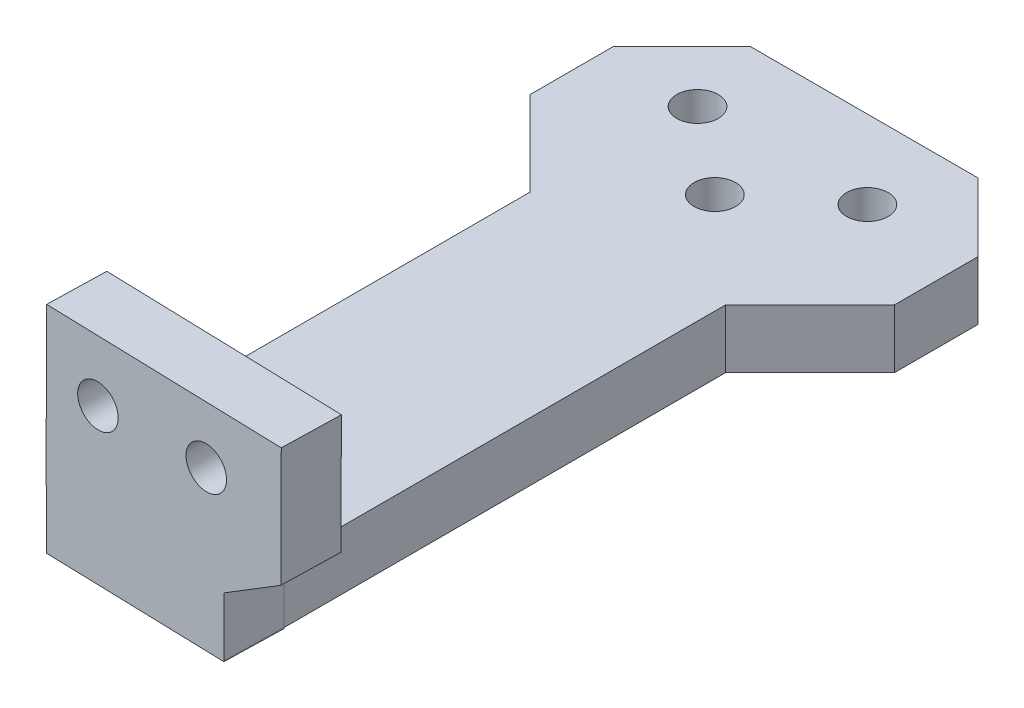
ISO-10303-21;
HEADER;
FILE_DESCRIPTION(('STEP AP214'),'2;1');
FILE_NAME('part.step','',(''),(''),'','','');
FILE_SCHEMA(('AUTOMOTIVE_DESIGN { 1 0 10303 214 1 1 1 1 }'));
ENDSEC;
DATA;
#1=APPLICATION_CONTEXT('core data for automotive mechanical design processes');
#2=APPLICATION_PROTOCOL_DEFINITION('international standard','automotive_design',2000,#1);
#3=PRODUCT_CONTEXT('',#1,'mechanical');
#4=PRODUCT('Part','Part','',(#3));
#5=PRODUCT_RELATED_PRODUCT_CATEGORY('part','',(#4));
#6=PRODUCT_DEFINITION_FORMATION('','',#4);
#7=PRODUCT_DEFINITION_CONTEXT('part definition',#1,'design');
#8=PRODUCT_DEFINITION('design','',#6,#7);
#9=PRODUCT_DEFINITION_SHAPE('','',#8);
#10=(LENGTH_UNIT() NAMED_UNIT(*) SI_UNIT(.MILLI.,.METRE.));
#11=(NAMED_UNIT(*) PLANE_ANGLE_UNIT() SI_UNIT($,.RADIAN.));
#12=(NAMED_UNIT(*) SI_UNIT($,.STERADIAN.) SOLID_ANGLE_UNIT());
#13=UNCERTAINTY_MEASURE_WITH_UNIT(LENGTH_MEASURE(1.E-05),#10,'distance_accuracy_value','');
#14=(GEOMETRIC_REPRESENTATION_CONTEXT(3) GLOBAL_UNCERTAINTY_ASSIGNED_CONTEXT((#13)) GLOBAL_UNIT_ASSIGNED_CONTEXT((#10,
#11,#12)) REPRESENTATION_CONTEXT('',''));
#15=CARTESIAN_POINT('',(0.,0.,0.));
#16=DIRECTION('',(0.,0.,1.));
#17=DIRECTION('',(1.,0.,0.));
#18=AXIS2_PLACEMENT_3D('',#15,#16,#17);
#19=CARTESIAN_POINT('',(0.5975916541765,0.,-24.3393126845238));
#20=DIRECTION('',(-0.0245451308027947,0.,0.999698722892989));
#21=DIRECTION('',(-0.999698722892989,0.,-0.0245451308027947));
#22=AXIS2_PLACEMENT_3D('',#19,#20,#21);
#23=PLANE('',#22);
#24=CARTESIAN_POINT('',(-3.38225333063673,16.7282372679157,-24.4370279396203));
#25=DIRECTION('',(-0.0245451308027946,0.,0.999698722892989));
#26=DIRECTION('',(0.999698722892989,0.,0.0245451308027946));
#27=AXIS2_PLACEMENT_3D('',#24,#25,#26);
#28=CIRCLE('',#27,2.24790000000673);
#29=CARTESIAN_POINT('',(-1.13503057143885,16.7282372679157,-24.3818529400885));
#30=VERTEX_POINT('',#29);
#31=EDGE_CURVE('E357',#30,#30,#28,.T.);
#32=ORIENTED_EDGE('',*,*,#31,.T.);
#33=EDGE_LOOP('',(#32));
#34=FACE_BOUND('',#33,.T.);
#35=CARTESIAN_POINT('',(8.62803223379969,17.0846353252613,-24.1421450680038));
#36=DIRECTION('',(-0.0245451308027946,0.,0.999698722892989));
#37=DIRECTION('',(0.999698722892989,0.,0.0245451308027946));
#38=AXIS2_PLACEMENT_3D('',#35,#36,#37);
#39=CIRCLE('',#38,2.24790000000672);
#40=CARTESIAN_POINT('',(10.8752549929976,17.0846353252613,-24.086970068472));
#41=VERTEX_POINT('',#40);
#42=EDGE_CURVE('E358',#41,#41,#39,.T.);
#43=ORIENTED_EDGE('',*,*,#42,.T.);
#44=EDGE_LOOP('',(#43));
#45=FACE_BOUND('',#44,.T.);
#46=DIRECTION('',(-0.999698722892989,0.,-0.0245451308027947));
#47=VECTOR('',#46,1.);
#48=CARTESIAN_POINT('',(0.597591654176501,6.35,-24.3393126845238));
#49=LINE('',#48,#47);
#50=CARTESIAN_POINT('',(10.5664845459525,6.35,-24.0945511634932));
#51=VERTEX_POINT('',#50);
#52=CARTESIAN_POINT('',(-9.14070594421671,6.35,-24.578412508176));
#53=VERTEX_POINT('',#52);
#54=EDGE_CURVE('E200',#51,#53,#49,.T.);
#55=ORIENTED_EDGE('',*,*,#54,.T.);
#56=DIRECTION('',(-0.00439645934331877,-0.99999032969989,-0.000107944190764562));
#57=VECTOR('',#56,1.);
#58=CARTESIAN_POINT('',(-9.06610570774999,23.3180893725102,-24.5765808837876));
#59=LINE('',#58,#57);
#60=CARTESIAN_POINT('',(-9.06610570774999,23.3180893725102,-24.5765808837876));
#61=VERTEX_POINT('',#60);
#62=EDGE_CURVE('E286',#61,#53,#59,.T.);
#63=ORIENTED_EDGE('',*,*,#62,.F.);
#64=DIRECTION('',(-0.999689055506319,0.00439778429504862,-0.0245448934440134));
#65=VECTOR('',#64,1.);
#66=CARTESIAN_POINT('',(16.9407170912385,23.203681401112,-23.9380476409732));
#67=LINE('',#66,#65);
#68=CARTESIAN_POINT('',(16.9407170912385,23.203681401112,-23.9380476409732));
#69=VERTEX_POINT('',#68);
#70=EDGE_CURVE('E383',#69,#61,#67,.T.);
#71=ORIENTED_EDGE('',*,*,#70,.F.);
#72=DIRECTION('',(0.00439645934331877,0.99999032969989,0.000107944190764413));
#73=VECTOR('',#72,1.);
#74=CARTESIAN_POINT('',(16.9407170912385,23.203681401112,-23.9380476409732));
#75=LINE('',#74,#73);
#76=CARTESIAN_POINT('',(16.8839683571341,10.2959797949635,-23.9394409658515));
#77=VERTEX_POINT('',#76);
#78=EDGE_CURVE('E305',#77,#69,#75,.T.);
#79=ORIENTED_EDGE('',*,*,#78,.F.);
#80=DIRECTION('',(-0.847962118438704,-0.529647797487237,-0.0208196135858428));
#81=VECTOR('',#80,1.);
#82=CARTESIAN_POINT('',(10.5664845459525,6.35,-24.0945511634932));
#83=LINE('',#82,#81);
#84=EDGE_CURVE('E172',#77,#51,#83,.T.);
#85=ORIENTED_EDGE('',*,*,#84,.T.);
#86=EDGE_LOOP('',(#55,#63,#71,#79,#85));
#87=FACE_BOUND('',#86,.T.);
#88=ADVANCED_FACE('F41',(#34,#45,#87),#23,.F.);
#89=CARTESIAN_POINT('',(0.,6.35,0.));
#90=DIRECTION('',(0.,1.,0.));
#91=DIRECTION('',(0.,0.,-1.));
#92=AXIS2_PLACEMENT_3D('',#89,#90,#91);
#93=PLANE('',#92);
#94=DIRECTION('',(0.179140165281254,0.,0.98382356201862));
#95=VECTOR('',#94,1.);
#96=CARTESIAN_POINT('',(-9.14070594421671,6.35,-24.578412508176));
#97=LINE('',#96,#95);
#98=CARTESIAN_POINT('',(-10.5664845459524,6.35,-32.4086753663532));
#99=VERTEX_POINT('',#98);
#100=EDGE_CURVE('E341',#99,#53,#97,.T.);
#101=ORIENTED_EDGE('',*,*,#100,.T.);
#102=ORIENTED_EDGE('',*,*,#54,.F.);
#103=DIRECTION('',(0.,0.,1.));
#104=VECTOR('',#103,1.);
#105=CARTESIAN_POINT('',(10.5664845459524,6.35,-71.843509550559));
#106=LINE('',#105,#104);
#107=CARTESIAN_POINT('',(10.5664845459524,6.35,-71.843509550559));
#108=VERTEX_POINT('',#107);
#109=EDGE_CURVE('E189',#108,#51,#106,.T.);
#110=ORIENTED_EDGE('',*,*,#109,.F.);
#111=DIRECTION('',(-0.707106781186547,0.,0.707106781186548));
#112=VECTOR('',#111,1.);
#113=CARTESIAN_POINT('',(19.6998793715268,6.35,-80.9769043761334));
#114=LINE('',#113,#112);
#115=CARTESIAN_POINT('',(19.6998793715268,6.35,-80.9769043761334));
#116=VERTEX_POINT('',#115);
#117=EDGE_CURVE('E229',#116,#108,#114,.T.);
#118=ORIENTED_EDGE('',*,*,#117,.F.);
#119=DIRECTION('',(0.,0.,1.));
#120=VECTOR('',#119,1.);
#121=CARTESIAN_POINT('',(19.6998793715268,6.35,14.5616917387912));
#122=LINE('',#121,#120);
#123=CARTESIAN_POINT('',(19.6998793715268,6.35,-90.0191075086382));
#124=VERTEX_POINT('',#123);
#125=EDGE_CURVE('E191',#124,#116,#122,.T.);
#126=ORIENTED_EDGE('',*,*,#125,.F.);
#127=DIRECTION('',(0.707106781186547,0.,0.707106781186548));
#128=VECTOR('',#127,1.);
#129=CARTESIAN_POINT('',(12.3270420752059,6.35,-97.3919448049591));
#130=LINE('',#129,#128);
#131=CARTESIAN_POINT('',(12.3270420752059,6.35,-97.3919448049591));
#132=VERTEX_POINT('',#131);
#133=EDGE_CURVE('E226',#132,#124,#130,.T.);
#134=ORIENTED_EDGE('',*,*,#133,.F.);
#135=DIRECTION('',(1.,0.,0.));
#136=VECTOR('',#135,1.);
#137=CARTESIAN_POINT('',(-19.6998793715268,6.35,-97.3919448049591));
#138=LINE('',#137,#136);
#139=CARTESIAN_POINT('',(-12.3270420752059,6.35,-97.3919448049591));
#140=VERTEX_POINT('',#139);
#141=EDGE_CURVE('E269',#140,#132,#138,.T.);
#142=ORIENTED_EDGE('',*,*,#141,.F.);
#143=DIRECTION('',(0.707106781186548,0.,-0.707106781186548));
#144=VECTOR('',#143,1.);
#145=CARTESIAN_POINT('',(-12.3270420752059,6.35,-97.3919448049591));
#146=LINE('',#145,#144);
#147=CARTESIAN_POINT('',(-19.6998793715268,6.35,-90.0191075086382));
#148=VERTEX_POINT('',#147);
#149=EDGE_CURVE('E223',#148,#140,#146,.T.);
#150=ORIENTED_EDGE('',*,*,#149,.F.);
#151=DIRECTION('',(0.,0.,-1.));
#152=VECTOR('',#151,1.);
#153=CARTESIAN_POINT('',(-19.6998793715268,6.35,14.5616917387912));
#154=LINE('',#153,#152);
#155=CARTESIAN_POINT('',(-19.6998793715268,6.35,-80.9769043761334));
#156=VERTEX_POINT('',#155);
#157=EDGE_CURVE('E266',#156,#148,#154,.T.);
#158=ORIENTED_EDGE('',*,*,#157,.F.);
#159=DIRECTION('',(-0.707106781186548,0.,-0.707106781186547));
#160=VECTOR('',#159,1.);
#161=CARTESIAN_POINT('',(-10.5664845459524,6.35,-71.843509550559));
#162=LINE('',#161,#160);
#163=CARTESIAN_POINT('',(-10.5664845459524,6.35,-71.843509550559));
#164=VERTEX_POINT('',#163);
#165=EDGE_CURVE('E219',#164,#156,#162,.T.);
#166=ORIENTED_EDGE('',*,*,#165,.F.);
#167=DIRECTION('',(0.,0.,-1.));
#168=VECTOR('',#167,1.);
#169=CARTESIAN_POINT('',(-10.5664845459524,6.35,-21.8784368138053));
#170=LINE('',#169,#168);
#171=EDGE_CURVE('E216',#99,#164,#170,.T.);
#172=ORIENTED_EDGE('',*,*,#171,.F.);
#173=EDGE_LOOP('',(#101,#102,#110,#118,#126,#134,#142,#150,#158,#166,#172));
#174=FACE_BOUND('',#173,.T.);
#175=CARTESIAN_POINT('',(8.83739968952087,6.35,-88.9179733151553));
#176=DIRECTION('',(0.,1.,0.));
#177=DIRECTION('',(0.,0.,1.));
#178=AXIS2_PLACEMENT_3D('',#175,#176,#177);
#179=CIRCLE('',#178,2.2479);
#180=CARTESIAN_POINT('',(8.83739968952087,6.35,-86.6700733151553));
#181=VERTEX_POINT('',#180);
#182=EDGE_CURVE('E255',#181,#181,#179,.T.);
#183=ORIENTED_EDGE('',*,*,#182,.F.);
#184=EDGE_LOOP('',(#183));
#185=FACE_BOUND('',#184,.T.);
#186=CARTESIAN_POINT('',(-0.345903119202115,6.35,-81.6070978447811));
#187=DIRECTION('',(0.,1.,0.));
#188=DIRECTION('',(0.,0.,1.));
#189=AXIS2_PLACEMENT_3D('',#186,#187,#188);
#190=CIRCLE('',#189,2.2479);
#191=CARTESIAN_POINT('',(-0.345903119202115,6.35,-79.3591978447811));
#192=VERTEX_POINT('',#191);
#193=EDGE_CURVE('E248',#192,#192,#190,.T.);
#194=ORIENTED_EDGE('',*,*,#193,.F.);
#195=EDGE_LOOP('',(#194));
#196=FACE_BOUND('',#195,.T.);
#197=CARTESIAN_POINT('',(-9.52920592792509,6.35,-88.9179733151553));
#198=DIRECTION('',(0.,1.,0.));
#199=DIRECTION('',(0.,0.,1.));
#200=AXIS2_PLACEMENT_3D('',#197,#198,#199);
#201=CIRCLE('',#200,2.2479);
#202=CARTESIAN_POINT('',(-9.52920592792509,6.35,-86.6700733151553));
#203=VERTEX_POINT('',#202);
#204=EDGE_CURVE('E260',#203,#203,#201,.T.);
#205=ORIENTED_EDGE('',*,*,#204,.F.);
#206=EDGE_LOOP('',(#205));
#207=FACE_BOUND('',#206,.T.);
#208=ADVANCED_FACE('F337',(#174,#185,#196,#207),#93,.T.);
#209=CARTESIAN_POINT('',(0.,0.,0.));
#210=DIRECTION('',(0.,1.,0.));
#211=DIRECTION('',(0.,0.,-1.));
#212=AXIS2_PLACEMENT_3D('',#209,#210,#211);
#213=PLANE('',#212);
#214=CARTESIAN_POINT('',(-9.52920592792509,0.,-88.9179733151553));
#215=DIRECTION('',(0.,1.,0.));
#216=DIRECTION('',(0.,0.,1.));
#217=AXIS2_PLACEMENT_3D('',#214,#215,#216);
#218=CIRCLE('',#217,2.2479);
#219=CARTESIAN_POINT('',(-9.52920592792509,0.,-86.6700733151553));
#220=VERTEX_POINT('',#219);
#221=EDGE_CURVE('E251',#220,#220,#218,.T.);
#222=ORIENTED_EDGE('',*,*,#221,.T.);
#223=EDGE_LOOP('',(#222));
#224=FACE_BOUND('',#223,.T.);
#225=CARTESIAN_POINT('',(-0.345903119202115,0.,-81.6070978447811));
#226=DIRECTION('',(0.,1.,0.));
#227=DIRECTION('',(0.,0.,1.));
#228=AXIS2_PLACEMENT_3D('',#225,#226,#227);
#229=CIRCLE('',#228,2.2479);
#230=CARTESIAN_POINT('',(-0.345903119202115,0.,-79.3591978447811));
#231=VERTEX_POINT('',#230);
#232=EDGE_CURVE('E252',#231,#231,#229,.T.);
#233=ORIENTED_EDGE('',*,*,#232,.T.);
#234=EDGE_LOOP('',(#233));
#235=FACE_BOUND('',#234,.T.);
#236=CARTESIAN_POINT('',(8.83739968952087,0.,-88.9179733151553));
#237=DIRECTION('',(0.,1.,0.));
#238=DIRECTION('',(0.,0.,1.));
#239=AXIS2_PLACEMENT_3D('',#236,#237,#238);
#240=CIRCLE('',#239,2.2479);
#241=CARTESIAN_POINT('',(8.83739968952087,0.,-86.6700733151553));
#242=VERTEX_POINT('',#241);
#243=EDGE_CURVE('E236',#242,#242,#240,.T.);
#244=ORIENTED_EDGE('',*,*,#243,.T.);
#245=EDGE_LOOP('',(#244));
#246=FACE_BOUND('',#245,.T.);
#247=DIRECTION('',(0.,0.,-1.));
#248=VECTOR('',#247,1.);
#249=CARTESIAN_POINT('',(-10.5664845459524,0.,-21.8784368138053));
#250=LINE('',#249,#248);
#251=CARTESIAN_POINT('',(-10.5664845459524,0.,-32.4086753663532));
#252=VERTEX_POINT('',#251);
#253=CARTESIAN_POINT('',(-10.5664845459524,0.,-71.843509550559));
#254=VERTEX_POINT('',#253);
#255=EDGE_CURVE('E233',#252,#254,#250,.T.);
#256=ORIENTED_EDGE('',*,*,#255,.T.);
#257=DIRECTION('',(-0.707106781186548,0.,-0.707106781186547));
#258=VECTOR('',#257,1.);
#259=CARTESIAN_POINT('',(-10.5664845459524,0.,-71.843509550559));
#260=LINE('',#259,#258);
#261=CARTESIAN_POINT('',(-19.6998793715268,0.,-80.9769043761334));
#262=VERTEX_POINT('',#261);
#263=EDGE_CURVE('E316',#254,#262,#260,.T.);
#264=ORIENTED_EDGE('',*,*,#263,.T.);
#265=DIRECTION('',(0.,0.,-1.));
#266=VECTOR('',#265,1.);
#267=CARTESIAN_POINT('',(-19.6998793715268,0.,14.5616917387912));
#268=LINE('',#267,#266);
#269=CARTESIAN_POINT('',(-19.6998793715268,0.,-90.0191075086382));
#270=VERTEX_POINT('',#269);
#271=EDGE_CURVE('E263',#262,#270,#268,.T.);
#272=ORIENTED_EDGE('',*,*,#271,.T.);
#273=DIRECTION('',(0.707106781186548,0.,-0.707106781186548));
#274=VECTOR('',#273,1.);
#275=CARTESIAN_POINT('',(-12.3270420752059,0.,-97.3919448049591));
#276=LINE('',#275,#274);
#277=CARTESIAN_POINT('',(-12.3270420752059,0.,-97.3919448049591));
#278=VERTEX_POINT('',#277);
#279=EDGE_CURVE('E319',#270,#278,#276,.T.);
#280=ORIENTED_EDGE('',*,*,#279,.T.);
#281=DIRECTION('',(1.,0.,0.));
#282=VECTOR('',#281,1.);
#283=CARTESIAN_POINT('',(-19.6998793715268,0.,-97.3919448049591));
#284=LINE('',#283,#282);
#285=CARTESIAN_POINT('',(12.3270420752059,0.,-97.3919448049591));
#286=VERTEX_POINT('',#285);
#287=EDGE_CURVE('E277',#278,#286,#284,.T.);
#288=ORIENTED_EDGE('',*,*,#287,.T.);
#289=DIRECTION('',(0.707106781186547,0.,0.707106781186548));
#290=VECTOR('',#289,1.);
#291=CARTESIAN_POINT('',(12.3270420752059,0.,-97.3919448049591));
#292=LINE('',#291,#290);
#293=CARTESIAN_POINT('',(19.6998793715268,0.,-90.0191075086382));
#294=VERTEX_POINT('',#293);
#295=EDGE_CURVE('E212',#286,#294,#292,.T.);
#296=ORIENTED_EDGE('',*,*,#295,.T.);
#297=DIRECTION('',(0.,0.,1.));
#298=VECTOR('',#297,1.);
#299=CARTESIAN_POINT('',(19.6998793715268,0.,14.5616917387912));
#300=LINE('',#299,#298);
#301=CARTESIAN_POINT('',(19.6998793715268,0.,-80.9769043761334));
#302=VERTEX_POINT('',#301);
#303=EDGE_CURVE('E270',#294,#302,#300,.T.);
#304=ORIENTED_EDGE('',*,*,#303,.T.);
#305=DIRECTION('',(-0.707106781186547,0.,0.707106781186548));
#306=VECTOR('',#305,1.);
#307=CARTESIAN_POINT('',(19.6998793715268,0.,-80.9769043761334));
#308=LINE('',#307,#306);
#309=CARTESIAN_POINT('',(10.5664845459524,0.,-71.843509550559));
#310=VERTEX_POINT('',#309);
#311=EDGE_CURVE('E207',#302,#310,#308,.T.);
#312=ORIENTED_EDGE('',*,*,#311,.T.);
#313=DIRECTION('',(0.,0.,1.));
#314=VECTOR('',#313,1.);
#315=CARTESIAN_POINT('',(10.5664845459524,0.,-71.843509550559));
#316=LINE('',#315,#314);
#317=CARTESIAN_POINT('',(10.5664845459525,0.,-24.0945511634932));
#318=VERTEX_POINT('',#317);
#319=EDGE_CURVE('E186',#310,#318,#316,.T.);
#320=ORIENTED_EDGE('',*,*,#319,.T.);
#321=DIRECTION('',(-0.999698722892989,0.,-0.0245451308027947));
#322=VECTOR('',#321,1.);
#323=CARTESIAN_POINT('',(0.597591654176501,0.,-24.3393126845238));
#324=LINE('',#323,#322);
#325=CARTESIAN_POINT('',(-9.14070594421671,-6.14072964439521E-05,-24.578412508176));
#326=VERTEX_POINT('',#325);
#327=EDGE_CURVE('E194',#318,#326,#324,.T.);
#328=ORIENTED_EDGE('',*,*,#327,.T.);
#329=DIRECTION('',(0.179140165281254,0.,0.98382356201862));
#330=VECTOR('',#329,1.);
#331=CARTESIAN_POINT('',(-4.51561340049107,0.,0.822228458576912));
#332=LINE('',#331,#330);
#333=EDGE_CURVE('E297',#252,#326,#332,.T.);
#334=ORIENTED_EDGE('',*,*,#333,.F.);
#335=EDGE_LOOP('',(#256,#264,#272,#280,#288,#296,#304,#312,#320,#328,#334));
#336=FACE_BOUND('',#335,.T.);
#337=ADVANCED_FACE('F204',(#224,#235,#246,#336),#213,.F.);
#338=CARTESIAN_POINT('',(10.5664845459524,0.,-71.843509550559));
#339=DIRECTION('',(1.,0.,0.));
#340=DIRECTION('',(0.,0.,1.));
#341=AXIS2_PLACEMENT_3D('',#338,#339,#340);
#342=PLANE('',#341);
#343=ORIENTED_EDGE('',*,*,#319,.F.);
#344=DIRECTION('',(0.,1.,0.));
#345=VECTOR('',#344,1.);
#346=CARTESIAN_POINT('',(10.5664845459524,0.,-71.843509550559));
#347=LINE('',#346,#345);
#348=EDGE_CURVE('E234',#310,#108,#347,.T.);
#349=ORIENTED_EDGE('',*,*,#348,.T.);
#350=ORIENTED_EDGE('',*,*,#109,.T.);
#351=DIRECTION('',(0.,1.,0.));
#352=VECTOR('',#351,1.);
#353=CARTESIAN_POINT('',(10.5664845459524,0.,-24.0945511634931));
#354=LINE('',#353,#352);
#355=EDGE_CURVE('E168',#318,#51,#354,.T.);
#356=ORIENTED_EDGE('',*,*,#355,.F.);
#357=EDGE_LOOP('',(#343,#349,#350,#356));
#358=FACE_BOUND('',#357,.T.);
#359=ADVANCED_FACE('F184',(#358),#342,.T.);
#360=CARTESIAN_POINT('',(-19.6998793715268,6.35,14.5616917387912));
#361=DIRECTION('',(1.,0.,0.));
#362=DIRECTION('',(0.,0.,1.));
#363=AXIS2_PLACEMENT_3D('',#360,#361,#362);
#364=PLANE('',#363);
#365=DIRECTION('',(0.,1.,0.));
#366=VECTOR('',#365,1.);
#367=CARTESIAN_POINT('',(-19.6998793715268,0.,-90.0191075086382));
#368=LINE('',#367,#366);
#369=EDGE_CURVE('E245',#270,#148,#368,.T.);
#370=ORIENTED_EDGE('',*,*,#369,.F.);
#371=ORIENTED_EDGE('',*,*,#271,.F.);
#372=DIRECTION('',(0.,1.,0.));
#373=VECTOR('',#372,1.);
#374=CARTESIAN_POINT('',(-19.6998793715268,0.,-80.9769043761334));
#375=LINE('',#374,#373);
#376=EDGE_CURVE('E210',#262,#156,#375,.T.);
#377=ORIENTED_EDGE('',*,*,#376,.T.);
#378=ORIENTED_EDGE('',*,*,#157,.T.);
#379=EDGE_LOOP('',(#370,#371,#377,#378));
#380=FACE_BOUND('',#379,.T.);
#381=ADVANCED_FACE('F43',(#380),#364,.F.);
#382=CARTESIAN_POINT('',(-19.6998793715268,6.35,-97.3919448049591));
#383=DIRECTION('',(0.,0.,1.));
#384=DIRECTION('',(-1.,0.,0.));
#385=AXIS2_PLACEMENT_3D('',#382,#383,#384);
#386=PLANE('',#385);
#387=DIRECTION('',(0.,1.,0.));
#388=VECTOR('',#387,1.);
#389=CARTESIAN_POINT('',(12.3270420752059,0.,-97.3919448049591));
#390=LINE('',#389,#388);
#391=EDGE_CURVE('E241',#286,#132,#390,.T.);
#392=ORIENTED_EDGE('',*,*,#391,.F.);
#393=ORIENTED_EDGE('',*,*,#287,.F.);
#394=DIRECTION('',(0.,1.,0.));
#395=VECTOR('',#394,1.);
#396=CARTESIAN_POINT('',(-12.3270420752059,0.,-97.3919448049591));
#397=LINE('',#396,#395);
#398=EDGE_CURVE('E243',#278,#140,#397,.T.);
#399=ORIENTED_EDGE('',*,*,#398,.T.);
#400=ORIENTED_EDGE('',*,*,#141,.T.);
#401=EDGE_LOOP('',(#392,#393,#399,#400));
#402=FACE_BOUND('',#401,.T.);
#403=ADVANCED_FACE('F486',(#402),#386,.F.);
#404=CARTESIAN_POINT('',(19.6998793715268,6.35,14.5616917387912));
#405=DIRECTION('',(-1.,0.,0.));
#406=DIRECTION('',(0.,0.,-1.));
#407=AXIS2_PLACEMENT_3D('',#404,#405,#406);
#408=PLANE('',#407);
#409=DIRECTION('',(0.,1.,0.));
#410=VECTOR('',#409,1.);
#411=CARTESIAN_POINT('',(19.6998793715268,0.,-80.9769043761334));
#412=LINE('',#411,#410);
#413=EDGE_CURVE('E237',#302,#116,#412,.T.);
#414=ORIENTED_EDGE('',*,*,#413,.F.);
#415=ORIENTED_EDGE('',*,*,#303,.F.);
#416=DIRECTION('',(0.,1.,0.));
#417=VECTOR('',#416,1.);
#418=CARTESIAN_POINT('',(19.6998793715268,0.,-90.0191075086382));
#419=LINE('',#418,#417);
#420=EDGE_CURVE('E239',#294,#124,#419,.T.);
#421=ORIENTED_EDGE('',*,*,#420,.T.);
#422=ORIENTED_EDGE('',*,*,#125,.T.);
#423=EDGE_LOOP('',(#414,#415,#421,#422));
#424=FACE_BOUND('',#423,.T.);
#425=ADVANCED_FACE('F330',(#424),#408,.F.);
#426=CARTESIAN_POINT('',(-9.52920592792509,6.35,-88.9179733151553));
#427=DIRECTION('',(0.,-1.,0.));
#428=DIRECTION('',(0.,0.,1.));
#429=AXIS2_PLACEMENT_3D('',#426,#427,#428);
#430=CYLINDRICAL_SURFACE('',#429,2.2479);
#431=ORIENTED_EDGE('',*,*,#204,.T.);
#432=EDGE_LOOP('',(#431));
#433=FACE_BOUND('',#432,.T.);
#434=ORIENTED_EDGE('',*,*,#221,.F.);
#435=EDGE_LOOP('',(#434));
#436=FACE_BOUND('',#435,.T.);
#437=ADVANCED_FACE('F472',(#433,#436),#430,.F.);
#438=CARTESIAN_POINT('',(-0.345903119202115,6.35,-81.6070978447811));
#439=DIRECTION('',(0.,-1.,0.));
#440=DIRECTION('',(0.,0.,1.));
#441=AXIS2_PLACEMENT_3D('',#438,#439,#440);
#442=CYLINDRICAL_SURFACE('',#441,2.2479);
#443=ORIENTED_EDGE('',*,*,#193,.T.);
#444=EDGE_LOOP('',(#443));
#445=FACE_BOUND('',#444,.T.);
#446=ORIENTED_EDGE('',*,*,#232,.F.);
#447=EDGE_LOOP('',(#446));
#448=FACE_BOUND('',#447,.T.);
#449=ADVANCED_FACE('F469',(#445,#448),#442,.F.);
#450=CARTESIAN_POINT('',(8.83739968952087,6.35,-88.9179733151553));
#451=DIRECTION('',(0.,-1.,0.));
#452=DIRECTION('',(0.,0.,1.));
#453=AXIS2_PLACEMENT_3D('',#450,#451,#452);
#454=CYLINDRICAL_SURFACE('',#453,2.2479);
#455=ORIENTED_EDGE('',*,*,#182,.T.);
#456=EDGE_LOOP('',(#455));
#457=FACE_BOUND('',#456,.T.);
#458=ORIENTED_EDGE('',*,*,#243,.F.);
#459=EDGE_LOOP('',(#458));
#460=FACE_BOUND('',#459,.T.);
#461=ADVANCED_FACE('F467',(#457,#460),#454,.F.);
#462=CARTESIAN_POINT('',(-10.5664845459524,0.,-21.8784368138053));
#463=DIRECTION('',(-1.,0.,0.));
#464=DIRECTION('',(0.,0.,-1.));
#465=AXIS2_PLACEMENT_3D('',#462,#463,#464);
#466=PLANE('',#465);
#467=DIRECTION('',(0.,1.,0.));
#468=VECTOR('',#467,1.);
#469=CARTESIAN_POINT('',(-10.5664845459524,-11.43,-32.4086753663532));
#470=LINE('',#469,#468);
#471=EDGE_CURVE('E368',#252,#99,#470,.T.);
#472=ORIENTED_EDGE('',*,*,#471,.T.);
#473=ORIENTED_EDGE('',*,*,#171,.T.);
#474=DIRECTION('',(0.,1.,0.));
#475=VECTOR('',#474,1.);
#476=CARTESIAN_POINT('',(-10.5664845459524,0.,-71.843509550559));
#477=LINE('',#476,#475);
#478=EDGE_CURVE('E208',#254,#164,#477,.T.);
#479=ORIENTED_EDGE('',*,*,#478,.F.);
#480=ORIENTED_EDGE('',*,*,#255,.F.);
#481=EDGE_LOOP('',(#472,#473,#479,#480));
#482=FACE_BOUND('',#481,.T.);
#483=ADVANCED_FACE('F463',(#482),#466,.T.);
#484=CARTESIAN_POINT('',(-10.5664845459524,0.,-71.843509550559));
#485=DIRECTION('',(-0.707106781186547,0.,0.707106781186548));
#486=DIRECTION('',(-0.707106781186548,0.,-0.707106781186547));
#487=AXIS2_PLACEMENT_3D('',#484,#485,#486);
#488=PLANE('',#487);
#489=ORIENTED_EDGE('',*,*,#165,.T.);
#490=ORIENTED_EDGE('',*,*,#376,.F.);
#491=ORIENTED_EDGE('',*,*,#263,.F.);
#492=ORIENTED_EDGE('',*,*,#478,.T.);
#493=EDGE_LOOP('',(#489,#490,#491,#492));
#494=FACE_BOUND('',#493,.T.);
#495=ADVANCED_FACE('F459',(#494),#488,.T.);
#496=CARTESIAN_POINT('',(-12.3270420752059,0.,-97.3919448049591));
#497=DIRECTION('',(-0.707106781186548,0.,-0.707106781186548));
#498=DIRECTION('',(0.707106781186548,0.,-0.707106781186548));
#499=AXIS2_PLACEMENT_3D('',#496,#497,#498);
#500=PLANE('',#499);
#501=ORIENTED_EDGE('',*,*,#149,.T.);
#502=ORIENTED_EDGE('',*,*,#398,.F.);
#503=ORIENTED_EDGE('',*,*,#279,.F.);
#504=ORIENTED_EDGE('',*,*,#369,.T.);
#505=EDGE_LOOP('',(#501,#502,#503,#504));
#506=FACE_BOUND('',#505,.T.);
#507=ADVANCED_FACE('F456',(#506),#500,.T.);
#508=CARTESIAN_POINT('',(12.3270420752059,0.,-97.3919448049591));
#509=DIRECTION('',(0.707106781186548,0.,-0.707106781186547));
#510=DIRECTION('',(0.707106781186547,0.,0.707106781186548));
#511=AXIS2_PLACEMENT_3D('',#508,#509,#510);
#512=PLANE('',#511);
#513=ORIENTED_EDGE('',*,*,#133,.T.);
#514=ORIENTED_EDGE('',*,*,#420,.F.);
#515=ORIENTED_EDGE('',*,*,#295,.F.);
#516=ORIENTED_EDGE('',*,*,#391,.T.);
#517=EDGE_LOOP('',(#513,#514,#515,#516));
#518=FACE_BOUND('',#517,.T.);
#519=ADVANCED_FACE('F326',(#518),#512,.T.);
#520=CARTESIAN_POINT('',(19.6998793715268,0.,-80.9769043761334));
#521=DIRECTION('',(0.707106781186548,0.,0.707106781186547));
#522=DIRECTION('',(-0.707106781186547,0.,0.707106781186548));
#523=AXIS2_PLACEMENT_3D('',#520,#521,#522);
#524=PLANE('',#523);
#525=ORIENTED_EDGE('',*,*,#117,.T.);
#526=ORIENTED_EDGE('',*,*,#348,.F.);
#527=ORIENTED_EDGE('',*,*,#311,.F.);
#528=ORIENTED_EDGE('',*,*,#413,.T.);
#529=EDGE_LOOP('',(#525,#526,#527,#528));
#530=FACE_BOUND('',#529,.T.);
#531=ADVANCED_FACE('F333',(#530),#524,.T.);
#532=CARTESIAN_POINT('',(16.9407170912385,23.203681401112,-23.9380476409732));
#533=DIRECTION('',(-0.999689055506319,0.00439778429504844,-0.0245448934440135));
#534=DIRECTION('',(0.0245451308027947,0.,-0.999698722892989));
#535=AXIS2_PLACEMENT_3D('',#532,#533,#534);
#536=PLANE('',#535);
#537=ORIENTED_EDGE('',*,*,#78,.T.);
#538=DIRECTION('',(-0.0245451308027946,0.,0.999698722892989));
#539=VECTOR('',#538,1.);
#540=CARTESIAN_POINT('',(16.9407170912385,23.203681401112,-23.9380476409732));
#541=LINE('',#540,#539);
#542=CARTESIAN_POINT('',(16.7848555106407,23.203681401112,-17.5899607506027));
#543=VERTEX_POINT('',#542);
#544=EDGE_CURVE('E201',#69,#543,#541,.T.);
#545=ORIENTED_EDGE('',*,*,#544,.T.);
#546=DIRECTION('',(0.00439645934331877,0.99999032969989,0.000107944190764413));
#547=VECTOR('',#546,1.);
#548=CARTESIAN_POINT('',(16.7848555106407,23.203681401112,-17.5899607506027));
#549=LINE('',#548,#547);
#550=CARTESIAN_POINT('',(16.7281067765363,10.2959797949635,-17.5913540754811));
#551=VERTEX_POINT('',#550);
#552=EDGE_CURVE('E293',#551,#543,#549,.T.);
#553=ORIENTED_EDGE('',*,*,#552,.F.);
#554=DIRECTION('',(0.0245451308027945,0.,-0.999698722892989));
#555=VECTOR('',#554,1.);
#556=CARTESIAN_POINT('',(16.4475559314604,10.2959797949635,-6.1647976728142));
#557=LINE('',#556,#555);
#558=EDGE_CURVE('E171',#551,#77,#557,.T.);
#559=ORIENTED_EDGE('',*,*,#558,.T.);
#560=EDGE_LOOP('',(#537,#545,#553,#559));
#561=FACE_BOUND('',#560,.T.);
#562=ADVANCED_FACE('F395',(#561),#536,.F.);
#563=CARTESIAN_POINT('',(16.9407170912385,23.203681401112,-23.9380476409732));
#564=DIRECTION('',(-0.00439645934331895,-0.99999032969989,-0.000107944190764538));
#565=DIRECTION('',(0.999990335525808,-0.00439645936893261,0.));
#566=AXIS2_PLACEMENT_3D('',#563,#564,#565);
#567=PLANE('',#566);
#568=DIRECTION('',(-0.999689055506319,0.00439778429504862,-0.0245448934440134));
#569=VECTOR('',#568,1.);
#570=CARTESIAN_POINT('',(16.7848555106407,23.203681401112,-17.5899607506027));
#571=LINE('',#570,#569);
#572=CARTESIAN_POINT('',(-9.22196728834774,23.3180893725102,-18.2284939934171));
#573=VERTEX_POINT('',#572);
#574=EDGE_CURVE('E296',#543,#573,#571,.T.);
#575=ORIENTED_EDGE('',*,*,#574,.F.);
#576=ORIENTED_EDGE('',*,*,#544,.F.);
#577=ORIENTED_EDGE('',*,*,#70,.T.);
#578=DIRECTION('',(-0.0245451308027946,0.,0.999698722892989));
#579=VECTOR('',#578,1.);
#580=CARTESIAN_POINT('',(-9.06610570774999,23.3180893725102,-24.5765808837876));
#581=LINE('',#580,#579);
#582=EDGE_CURVE('E285',#61,#573,#581,.T.);
#583=ORIENTED_EDGE('',*,*,#582,.T.);
#584=EDGE_LOOP('',(#575,#576,#577,#583));
#585=FACE_BOUND('',#584,.T.);
#586=ADVANCED_FACE('F388',(#585),#567,.F.);
#587=CARTESIAN_POINT('',(-9.06610570774999,23.3180893725102,-24.5765808837876));
#588=DIRECTION('',(0.999689055506319,-0.00439778429504844,0.0245448934440135));
#589=DIRECTION('',(-0.0245451308027947,0.,0.999698722892989));
#590=AXIS2_PLACEMENT_3D('',#587,#588,#589);
#591=PLANE('',#590);
#592=DIRECTION('',(-0.0245451308027947,0.,0.999698722892989));
#593=VECTOR('',#592,1.);
#594=CARTESIAN_POINT('',(-9.73829759839321,6.35,-0.239099823652259));
#595=LINE('',#594,#593);
#596=CARTESIAN_POINT('',(-9.29656752481445,6.35,-18.2303256178056));
#597=VERTEX_POINT('',#596);
#598=EDGE_CURVE('E220',#53,#597,#595,.T.);
#599=ORIENTED_EDGE('',*,*,#598,.T.);
#600=DIRECTION('',(-0.00439645934331877,-0.99999032969989,-0.000107944190764562));
#601=VECTOR('',#600,1.);
#602=CARTESIAN_POINT('',(-9.22196728834774,23.3180893725102,-18.2284939934171));
#603=LINE('',#602,#601);
#604=EDGE_CURVE('E300',#573,#597,#603,.T.);
#605=ORIENTED_EDGE('',*,*,#604,.F.);
#606=ORIENTED_EDGE('',*,*,#582,.F.);
#607=ORIENTED_EDGE('',*,*,#62,.T.);
#608=EDGE_LOOP('',(#599,#605,#606,#607));
#609=FACE_BOUND('',#608,.T.);
#610=ADVANCED_FACE('F387',(#609),#591,.F.);
#611=CARTESIAN_POINT('',(16.8381990679683,-0.114407971398249,-23.9405647176015));
#612=DIRECTION('',(0.00439645934331895,0.99999032969989,0.000107944190764538));
#613=DIRECTION('',(-0.999990335525808,0.00439645936893261,0.));
#614=AXIS2_PLACEMENT_3D('',#611,#612,#613);
#615=PLANE('',#614);
#616=DIRECTION('',(0.999689055506319,-0.00439778429504862,0.0245448934440136));
#617=VECTOR('',#616,1.);
#618=CARTESIAN_POINT('',(16.6823374873706,-0.11440797139825,-17.5924778272311));
#619=LINE('',#618,#617);
#620=CARTESIAN_POINT('',(-9.22196728834774,-0.000450992386302404,-18.2284939934171));
#621=VERTEX_POINT('',#620);
#622=CARTESIAN_POINT('',(10.4189352757221,-0.0868543118595751,-17.7462601848903));
#623=VERTEX_POINT('',#622);
#624=EDGE_CURVE('E302',#621,#623,#619,.T.);
#625=ORIENTED_EDGE('',*,*,#624,.F.);
#626=DIRECTION('',(-0.0127961785031248,-5.16779739524786E-05,0.99991812422073));
#627=VECTOR('',#626,1.);
#628=CARTESIAN_POINT('',(-9.14461352305402,-0.000138595535398899,-24.2730667441822));
#629=LINE('',#628,#627);
#630=EDGE_CURVE('E377',#326,#621,#629,.T.);
#631=ORIENTED_EDGE('',*,*,#630,.F.);
#632=DIRECTION('',(0.999689055506319,-0.00439778429504862,0.0245448934440136));
#633=VECTOR('',#632,1.);
#634=CARTESIAN_POINT('',(16.8381990679683,-0.114407971398249,-23.9405647176015));
#635=LINE('',#634,#633);
#636=CARTESIAN_POINT('',(10.5747968563198,-0.0868543118595743,-24.0943470752608));
#637=VERTEX_POINT('',#636);
#638=EDGE_CURVE('E196',#326,#637,#635,.T.);
#639=ORIENTED_EDGE('',*,*,#638,.T.);
#640=DIRECTION('',(0.0245451308027945,0.,-0.999698722892989));
#641=VECTOR('',#640,1.);
#642=CARTESIAN_POINT('',(10.5747968563198,-0.0868543118595743,-24.0943470752608));
#643=LINE('',#642,#641);
#644=EDGE_CURVE('E176',#623,#637,#643,.T.);
#645=ORIENTED_EDGE('',*,*,#644,.F.);
#646=EDGE_LOOP('',(#625,#631,#639,#645));
#647=FACE_BOUND('',#646,.T.);
#648=ADVANCED_FACE('F438',(#647),#615,.F.);
#649=ORIENTED_EDGE('',*,*,#638,.F.);
#650=ORIENTED_EDGE('',*,*,#327,.F.);
#651=DIRECTION('',(0.0952684989294179,-0.995448864485207,0.0023390824796108));
#652=VECTOR('',#651,1.);
#653=CARTESIAN_POINT('',(10.5664845459525,0.,-24.0945511634932));
#654=LINE('',#653,#652);
#655=EDGE_CURVE('E174',#318,#637,#654,.T.);
#656=ORIENTED_EDGE('',*,*,#655,.T.);
#657=EDGE_LOOP('',(#649,#650,#656));
#658=FACE_BOUND('',#657,.T.);
#659=ADVANCED_FACE('F195',(#658),#23,.F.);
#660=CARTESIAN_POINT('',(0.441730073578754,0.,-17.9912257941533));
#661=DIRECTION('',(-0.0245451308027947,0.,0.999698722892989));
#662=DIRECTION('',(-0.999698722892989,0.,-0.0245451308027947));
#663=AXIS2_PLACEMENT_3D('',#660,#661,#662);
#664=PLANE('',#663);
#665=DIRECTION('',(0.847962118438704,0.529647797487237,0.0208196135858431));
#666=VECTOR('',#665,1.);
#667=CARTESIAN_POINT('',(0.386351535976181,0.0887140668968627,-17.9925854772438));
#668=LINE('',#667,#666);
#669=CARTESIAN_POINT('',(10.4106229653547,6.35,-17.7464642731227));
#670=VERTEX_POINT('',#669);
#671=EDGE_CURVE('E11',#670,#551,#668,.T.);
#672=ORIENTED_EDGE('',*,*,#671,.T.);
#673=ORIENTED_EDGE('',*,*,#552,.T.);
#674=ORIENTED_EDGE('',*,*,#574,.T.);
#675=ORIENTED_EDGE('',*,*,#604,.T.);
#676=DIRECTION('',(-0.999698722892989,0.,-0.0245451308027947));
#677=VECTOR('',#676,1.);
#678=CARTESIAN_POINT('',(0.441730073578754,6.35,-17.9912257941533));
#679=LINE('',#678,#677);
#680=CARTESIAN_POINT('',(-9.22196728834774,6.35,-18.2284939934171));
#681=VERTEX_POINT('',#680);
#682=EDGE_CURVE('E64',#681,#597,#679,.T.);
#683=ORIENTED_EDGE('',*,*,#682,.F.);
#684=DIRECTION('',(0.,-1.,0.));
#685=VECTOR('',#684,1.);
#686=CARTESIAN_POINT('',(-9.22196728834774,0.,-18.2284939934171));
#687=LINE('',#686,#685);
#688=EDGE_CURVE('E282',#681,#621,#687,.T.);
#689=ORIENTED_EDGE('',*,*,#688,.T.);
#690=ORIENTED_EDGE('',*,*,#624,.T.);
#691=DIRECTION('',(-0.0952684989294179,0.995448864485208,-0.00233908247961101));
#692=VECTOR('',#691,1.);
#693=CARTESIAN_POINT('',(10.3200898844173,0.94596906249506,-17.7486870891198));
#694=LINE('',#693,#692);
#695=CARTESIAN_POINT('',(10.4106229653547,0.,-17.7464642731227));
#696=VERTEX_POINT('',#695);
#697=EDGE_CURVE('E56',#623,#696,#694,.T.);
#698=ORIENTED_EDGE('',*,*,#697,.T.);
#699=DIRECTION('',(0.,1.,0.));
#700=VECTOR('',#699,1.);
#701=CARTESIAN_POINT('',(10.4106229653547,0.,-17.7464642731227));
#702=LINE('',#701,#700);
#703=EDGE_CURVE('E49',#696,#670,#702,.T.);
#704=ORIENTED_EDGE('',*,*,#703,.T.);
#705=EDGE_LOOP('',(#672,#673,#674,#675,#683,#689,#690,#698,#704));
#706=FACE_BOUND('',#705,.T.);
#707=CARTESIAN_POINT('',(8.47217065320195,17.0846353252613,-17.7940581776333));
#708=DIRECTION('',(0.0245451308027947,0.,-0.999698722892989));
#709=DIRECTION('',(-0.999698722892989,0.,-0.0245451308027947));
#710=AXIS2_PLACEMENT_3D('',#707,#708,#709);
#711=CIRCLE('',#710,2.24790000000672);
#712=CARTESIAN_POINT('',(10.7193934123998,17.0846353252613,-17.7388831781015));
#713=VERTEX_POINT('',#712);
#714=EDGE_CURVE('E366',#713,#713,#711,.T.);
#715=ORIENTED_EDGE('',*,*,#714,.T.);
#716=EDGE_LOOP('',(#715));
#717=FACE_BOUND('',#716,.T.);
#718=CARTESIAN_POINT('',(-3.53811491123447,16.7282372679157,-18.0889410492498));
#719=DIRECTION('',(0.0245451308027947,0.,-0.999698722892989));
#720=DIRECTION('',(-0.999698722892989,0.,-0.0245451308027947));
#721=AXIS2_PLACEMENT_3D('',#718,#719,#720);
#722=CIRCLE('',#721,2.24790000000673);
#723=CARTESIAN_POINT('',(-1.2908921520366,16.7282372679157,-18.033766049718));
#724=VERTEX_POINT('',#723);
#725=EDGE_CURVE('E361',#724,#724,#722,.T.);
#726=ORIENTED_EDGE('',*,*,#725,.T.);
#727=EDGE_LOOP('',(#726));
#728=FACE_BOUND('',#727,.T.);
#729=ADVANCED_FACE('F390',(#706,#717,#728),#664,.T.);
#730=CARTESIAN_POINT('',(-9.14070594421671,-11.43,-24.578412508176));
#731=DIRECTION('',(0.98382356201862,0.,-0.179140165281254));
#732=DIRECTION('',(0.179140165281254,0.,0.98382356201862));
#733=AXIS2_PLACEMENT_3D('',#730,#731,#732);
#734=PLANE('',#733);
#735=ORIENTED_EDGE('',*,*,#471,.F.);
#736=ORIENTED_EDGE('',*,*,#333,.T.);
#737=DIRECTION('',(0.,1.,0.));
#738=VECTOR('',#737,1.);
#739=CARTESIAN_POINT('',(-9.14070594421671,-11.43,-24.578412508176));
#740=LINE('',#739,#738);
#741=EDGE_CURVE('E373',#326,#53,#740,.T.);
#742=ORIENTED_EDGE('',*,*,#741,.T.);
#743=ORIENTED_EDGE('',*,*,#100,.F.);
#744=EDGE_LOOP('',(#735,#736,#742,#743));
#745=FACE_BOUND('',#744,.T.);
#746=ADVANCED_FACE('F432',(#745),#734,.F.);
#747=CARTESIAN_POINT('',(-9.22196728834774,-11.43,-18.2284939934171));
#748=DIRECTION('',(0.999918125555927,0.,0.0127961785202116));
#749=DIRECTION('',(-0.0127961785202116,0.,0.999918125555927));
#750=AXIS2_PLACEMENT_3D('',#747,#748,#749);
#751=PLANE('',#750);
#752=ORIENTED_EDGE('',*,*,#741,.F.);
#753=ORIENTED_EDGE('',*,*,#630,.T.);
#754=ORIENTED_EDGE('',*,*,#688,.F.);
#755=DIRECTION('',(-0.0127961785202116,0.,0.999918125555927));
#756=VECTOR('',#755,1.);
#757=CARTESIAN_POINT('',(-9.22196728834774,6.35,-18.2284939934171));
#758=LINE('',#757,#756);
#759=EDGE_CURVE('E365',#53,#681,#758,.T.);
#760=ORIENTED_EDGE('',*,*,#759,.F.);
#761=EDGE_LOOP('',(#752,#753,#754,#760));
#762=FACE_BOUND('',#761,.T.);
#763=ADVANCED_FACE('F429',(#762),#751,.F.);
#764=CARTESIAN_POINT('',(0.,6.35,0.));
#765=DIRECTION('',(0.,-1.,0.));
#766=DIRECTION('',(0.,0.,1.));
#767=AXIS2_PLACEMENT_3D('',#764,#765,#766);
#768=PLANE('',#767);
#769=ORIENTED_EDGE('',*,*,#598,.F.);
#770=ORIENTED_EDGE('',*,*,#759,.T.);
#771=ORIENTED_EDGE('',*,*,#682,.T.);
#772=EDGE_LOOP('',(#769,#770,#771));
#773=FACE_BOUND('',#772,.T.);
#774=ADVANCED_FACE('F408',(#773),#768,.T.);
#775=CARTESIAN_POINT('',(-3.81866575631041,16.7282372679157,-6.66238464658291));
#776=DIRECTION('',(0.0245451308027945,0.,-0.999698722892989));
#777=DIRECTION('',(0.999698722892989,0.,0.0245451308027946));
#778=AXIS2_PLACEMENT_3D('',#775,#776,#777);
#779=CYLINDRICAL_SURFACE('',#778,2.24790000000673);
#780=CARTESIAN_POINT('',(-1.2908921520366,16.7282372679157,-18.033766049718));
#781=CARTESIAN_POINT('',(-1.28926859390537,16.7282372679157,-18.099891954826));
#782=CARTESIAN_POINT('',(-1.28764503577414,16.7282372679157,-18.1660178599341));
#783=CARTESIAN_POINT('',(-1.28439791951169,16.7282372679157,-18.2982696701501));
#784=CARTESIAN_POINT('',(-1.28277436138046,16.7282372679157,-18.3643955752581));
#785=CARTESIAN_POINT('',(-1.27952724511801,16.7282372679157,-18.4966473854742));
#786=CARTESIAN_POINT('',(-1.27790368698678,16.7282372679157,-18.5627732905822));
#787=CARTESIAN_POINT('',(-1.27465657072433,16.7282372679157,-18.6950251007983));
#788=CARTESIAN_POINT('',(-1.27303301259311,16.7282372679157,-18.7611510059063));
#789=CARTESIAN_POINT('',(-1.26978589633065,16.7282372679157,-18.8934028161223));
#790=CARTESIAN_POINT('',(-1.26816233819943,16.7282372679157,-18.9595287212304));
#791=CARTESIAN_POINT('',(-1.26491522193697,16.7282372679157,-19.0917805314464));
#792=CARTESIAN_POINT('',(-1.26329166380575,16.7282372679157,-19.1579064365544));
#793=CARTESIAN_POINT('',(-1.26004454754329,16.7282372679157,-19.2901582467705));
#794=CARTESIAN_POINT('',(-1.25842098941207,16.7282372679157,-19.3562841518785));
#795=CARTESIAN_POINT('',(-1.25517387314961,16.7282372679157,-19.4885359620946));
#796=CARTESIAN_POINT('',(-1.25355031501839,16.7282372679157,-19.5546618672026));
#797=CARTESIAN_POINT('',(-1.25030319875593,16.7282372679157,-19.6869136774187));
#798=CARTESIAN_POINT('',(-1.24867964062471,16.7282372679157,-19.7530395825267));
#799=CARTESIAN_POINT('',(-1.24543252436225,16.7282372679157,-19.8852913927427));
#800=CARTESIAN_POINT('',(-1.24380896623103,16.7282372679157,-19.9514172978508));
#801=CARTESIAN_POINT('',(-1.24056184996857,16.7282372679157,-20.0836691080668));
#802=CARTESIAN_POINT('',(-1.23893829183735,16.7282372679157,-20.1497950131748));
#803=CARTESIAN_POINT('',(-1.2356911755749,16.7282372679157,-20.2820468233909));
#804=CARTESIAN_POINT('',(-1.23406761744367,16.7282372679157,-20.3481727284989));
#805=CARTESIAN_POINT('',(-1.23082050118122,16.7282372679157,-20.480424538715));
#806=CARTESIAN_POINT('',(-1.22919694304999,16.7282372679157,-20.546550443823));
#807=CARTESIAN_POINT('',(-1.22594982678754,16.7282372679157,-20.678802254039));
#808=CARTESIAN_POINT('',(-1.22432626865631,16.7282372679157,-20.7449281591471));
#809=CARTESIAN_POINT('',(-1.22107915239386,16.7282372679157,-20.8771799693631));
#810=CARTESIAN_POINT('',(-1.21945559426263,16.7282372679157,-20.9433058744711));
#811=CARTESIAN_POINT('',(-1.21620847800018,16.7282372679157,-21.0755576846872));
#812=CARTESIAN_POINT('',(-1.21458491986895,16.7282372679157,-21.1416835897952));
#813=CARTESIAN_POINT('',(-1.2113378036065,16.7282372679157,-21.2739354000113));
#814=CARTESIAN_POINT('',(-1.20971424547527,16.7282372679157,-21.3400613051193));
#815=CARTESIAN_POINT('',(-1.20646712921282,16.7282372679157,-21.4723131153354));
#816=CARTESIAN_POINT('',(-1.20484357108159,16.7282372679157,-21.5384390204434));
#817=CARTESIAN_POINT('',(-1.20159645481914,16.7282372679157,-21.6706908306594));
#818=CARTESIAN_POINT('',(-1.19997289668791,16.7282372679157,-21.7368167357675));
#819=CARTESIAN_POINT('',(-1.19672578042546,16.7282372679157,-21.8690685459835));
#820=CARTESIAN_POINT('',(-1.19510222229423,16.7282372679157,-21.9351944510915));
#821=CARTESIAN_POINT('',(-1.19185510603178,16.7282372679157,-22.0674462613076));
#822=CARTESIAN_POINT('',(-1.19023154790055,16.7282372679157,-22.1335721664156));
#823=CARTESIAN_POINT('',(-1.1869844316381,16.7282372679157,-22.2658239766317));
#824=CARTESIAN_POINT('',(-1.18536087350687,16.7282372679157,-22.3319498817397));
#825=CARTESIAN_POINT('',(-1.18211375724442,16.7282372679157,-22.4642016919557));
#826=CARTESIAN_POINT('',(-1.18049019911319,16.7282372679157,-22.5303275970638));
#827=CARTESIAN_POINT('',(-1.17724308285074,16.7282372679157,-22.6625794072798));
#828=CARTESIAN_POINT('',(-1.17561952471951,16.7282372679157,-22.7287053123878));
#829=CARTESIAN_POINT('',(-1.17237240845706,16.7282372679157,-22.8609571226039));
#830=CARTESIAN_POINT('',(-1.17074885032583,16.7282372679157,-22.9270830277119));
#831=CARTESIAN_POINT('',(-1.16750173406338,16.7282372679157,-23.059334837928));
#832=CARTESIAN_POINT('',(-1.16587817593216,16.7282372679157,-23.125460743036));
#833=CARTESIAN_POINT('',(-1.1626310596697,16.7282372679157,-23.2577125532521));
#834=CARTESIAN_POINT('',(-1.16100750153848,16.7282372679157,-23.3238384583601));
#835=CARTESIAN_POINT('',(-1.15776038527602,16.7282372679157,-23.4560902685761));
#836=CARTESIAN_POINT('',(-1.1561368271448,16.7282372679157,-23.5222161736842));
#837=CARTESIAN_POINT('',(-1.15288971088234,16.7282372679157,-23.6544679839002));
#838=CARTESIAN_POINT('',(-1.15126615275112,16.7282372679157,-23.7205938890082));
#839=CARTESIAN_POINT('',(-1.14801903648866,16.7282372679157,-23.8528456992243));
#840=CARTESIAN_POINT('',(-1.14639547835744,16.7282372679157,-23.9189716043323));
#841=CARTESIAN_POINT('',(-1.14314836209498,16.7282372679157,-24.0512234145484));
#842=CARTESIAN_POINT('',(-1.14152480396376,16.7282372679157,-24.1173493196564));
#843=CARTESIAN_POINT('',(-1.1382776877013,16.7282372679157,-24.2496011298724));
#844=CARTESIAN_POINT('',(-1.13665412957008,16.7282372679157,-24.3157270349805));
#845=CARTESIAN_POINT('',(-1.13503057143885,16.7282372679157,-24.3818529400885));
#846=B_SPLINE_CURVE_WITH_KNOTS('',3,(#780,#781,#782,#783,#784,#785,#786,#787,#788,#789,#790,
#791,#792,#793,#794,#795,#796,#797,#798,#799,#800,#801,#802,#803,#804,#805,#806,#807,#808,#809,
#810,#811,#812,#813,#814,#815,#816,#817,#818,#819,#820,#821,#822,#823,#824,#825,#826,#827,#828,
#829,#830,#831,#832,#833,#834,#835,#836,#837,#838,#839,#840,#841,#842,#843,#844,#845),
.UNSPECIFIED.,.F.,.F.,(4,2,2,2,2,2,2,2,2,2,2,2,2,2,2,2,2,2,2,2,2,2,2,2,2,2,2,2,2,2,2,2,4),(0.,
0.1984375,0.396875,0.595312499999999,0.793749999999999,0.992187500000002,1.190625,1.3890625,
1.5875,1.7859375,1.984375,2.1828125,2.38125,2.5796875,2.778125,2.9765625,3.175,3.3734375,
3.57187500000001,3.7703125,3.96875000000001,4.16718750000001,4.365625,4.56406250000001,
4.76250000000001,4.96093750000001,5.15937500000001,5.3578125,5.55625,5.75468750000001,5.953125,
6.1515625,6.35000000000001),.UNSPECIFIED.);
#847=EDGE_CURVE('BSEAM404',#724,#30,#846,.T.);
#848=ORIENTED_EDGE('',*,*,#725,.F.);
#849=ORIENTED_EDGE('',*,*,#31,.F.);
#850=ORIENTED_EDGE('',*,*,#847,.T.);
#851=ORIENTED_EDGE('',*,*,#847,.F.);
#852=EDGE_LOOP('',(#848,#850,#849,#851));
#853=FACE_BOUND('',#852,.T.);
#854=ADVANCED_FACE('F404',(#853),#779,.F.);
#855=CARTESIAN_POINT('',(8.19161980812601,17.0846353252613,-6.36750177496643));
#856=DIRECTION('',(0.0245451308027945,0.,-0.999698722892989));
#857=DIRECTION('',(0.999698722892989,0.,0.0245451308027946));
#858=AXIS2_PLACEMENT_3D('',#855,#856,#857);
#859=CYLINDRICAL_SURFACE('',#858,2.24790000000672);
#860=CARTESIAN_POINT('',(10.7193934123998,17.0846353252613,-17.7388831781015));
#861=CARTESIAN_POINT('',(10.721016970531,17.0846353252613,-17.8050090832096));
#862=CARTESIAN_POINT('',(10.7226405286623,17.0846353252613,-17.8711349883176));
#863=CARTESIAN_POINT('',(10.7258876449247,17.0846353252613,-18.0033867985336));
#864=CARTESIAN_POINT('',(10.7275112030559,17.0846353252613,-18.0695127036417));
#865=CARTESIAN_POINT('',(10.7307583193184,17.0846353252613,-18.2017645138577));
#866=CARTESIAN_POINT('',(10.7323818774496,17.0846353252613,-18.2678904189657));
#867=CARTESIAN_POINT('',(10.7356289937121,17.0846353252613,-18.4001422291818));
#868=CARTESIAN_POINT('',(10.7372525518433,17.0846353252613,-18.4662681342898));
#869=CARTESIAN_POINT('',(10.7404996681058,17.0846353252613,-18.5985199445059));
#870=CARTESIAN_POINT('',(10.742123226237,17.0846353252613,-18.6646458496139));
#871=CARTESIAN_POINT('',(10.7453703424994,17.0846353252613,-18.7968976598299));
#872=CARTESIAN_POINT('',(10.7469939006307,17.0846353252613,-18.863023564938));
#873=CARTESIAN_POINT('',(10.7502410168931,17.0846353252613,-18.995275375154));
#874=CARTESIAN_POINT('',(10.7518645750243,17.0846353252613,-19.0614012802621));
#875=CARTESIAN_POINT('',(10.7551116912868,17.0846353252613,-19.1936530904781));
#876=CARTESIAN_POINT('',(10.756735249418,17.0846353252613,-19.2597789955861));
#877=CARTESIAN_POINT('',(10.7599823656805,17.0846353252613,-19.3920308058022));
#878=CARTESIAN_POINT('',(10.7616059238117,17.0846353252613,-19.4581567109102));
#879=CARTESIAN_POINT('',(10.7648530400742,17.0846353252613,-19.5904085211263));
#880=CARTESIAN_POINT('',(10.7664765982054,17.0846353252613,-19.6565344262343));
#881=CARTESIAN_POINT('',(10.7697237144678,17.0846353252613,-19.7887862364503));
#882=CARTESIAN_POINT('',(10.7713472725991,17.0846353252613,-19.8549121415584));
#883=CARTESIAN_POINT('',(10.7745943888615,17.0846353252613,-19.9871639517744));
#884=CARTESIAN_POINT('',(10.7762179469927,17.0846353252613,-20.0532898568824));
#885=CARTESIAN_POINT('',(10.7794650632552,17.0846353252613,-20.1855416670985));
#886=CARTESIAN_POINT('',(10.7810886213864,17.0846353252613,-20.2516675722065));
#887=CARTESIAN_POINT('',(10.7843357376489,17.0846353252613,-20.3839193824226));
#888=CARTESIAN_POINT('',(10.7859592957801,17.0846353252613,-20.4500452875306));
#889=CARTESIAN_POINT('',(10.7892064120426,17.0846353252613,-20.5822970977466));
#890=CARTESIAN_POINT('',(10.7908299701738,17.0846353252613,-20.6484230028547));
#891=CARTESIAN_POINT('',(10.7940770864362,17.0846353252613,-20.7806748130707));
#892=CARTESIAN_POINT('',(10.7957006445675,17.0846353252613,-20.8468007181787));
#893=CARTESIAN_POINT('',(10.7989477608299,17.0846353252613,-20.9790525283948));
#894=CARTESIAN_POINT('',(10.8005713189611,17.0846353252613,-21.0451784335028));
#895=CARTESIAN_POINT('',(10.8038184352236,17.0846353252613,-21.1774302437189));
#896=CARTESIAN_POINT('',(10.8054419933548,17.0846353252613,-21.2435561488269));
#897=CARTESIAN_POINT('',(10.8086891096173,17.0846353252613,-21.375807959043));
#898=CARTESIAN_POINT('',(10.8103126677485,17.0846353252613,-21.441933864151));
#899=CARTESIAN_POINT('',(10.813559784011,17.0846353252613,-21.574185674367));
#900=CARTESIAN_POINT('',(10.8151833421422,17.0846353252613,-21.6403115794751));
#901=CARTESIAN_POINT('',(10.8184304584046,17.0846353252613,-21.7725633896911));
#902=CARTESIAN_POINT('',(10.8200540165359,17.0846353252613,-21.8386892947991));
#903=CARTESIAN_POINT('',(10.8233011327983,17.0846353252613,-21.9709411050152));
#904=CARTESIAN_POINT('',(10.8249246909295,17.0846353252613,-22.0370670101232));
#905=CARTESIAN_POINT('',(10.828171807192,17.0846353252613,-22.1693188203393));
#906=CARTESIAN_POINT('',(10.8297953653232,17.0846353252613,-22.2354447254473));
#907=CARTESIAN_POINT('',(10.8330424815857,17.0846353252613,-22.3676965356633));
#908=CARTESIAN_POINT('',(10.8346660397169,17.0846353252613,-22.4338224407714));
#909=CARTESIAN_POINT('',(10.8379131559793,17.0846353252613,-22.5660742509874));
#910=CARTESIAN_POINT('',(10.8395367141106,17.0846353252613,-22.6322001560954));
#911=CARTESIAN_POINT('',(10.842783830373,17.0846353252613,-22.7644519663115));
#912=CARTESIAN_POINT('',(10.8444073885043,17.0846353252613,-22.8305778714195));
#913=CARTESIAN_POINT('',(10.8476545047667,17.0846353252613,-22.9628296816356));
#914=CARTESIAN_POINT('',(10.8492780628979,17.0846353252613,-23.0289555867436));
#915=CARTESIAN_POINT('',(10.8525251791604,17.0846353252613,-23.1612073969597));
#916=CARTESIAN_POINT('',(10.8541487372916,17.0846353252613,-23.2273333020677));
#917=CARTESIAN_POINT('',(10.8573958535541,17.0846353252613,-23.3595851122837));
#918=CARTESIAN_POINT('',(10.8590194116853,17.0846353252613,-23.4257110173918));
#919=CARTESIAN_POINT('',(10.8622665279477,17.0846353252613,-23.5579628276078));
#920=CARTESIAN_POINT('',(10.863890086079,17.0846353252613,-23.6240887327158));
#921=CARTESIAN_POINT('',(10.8671372023414,17.0846353252613,-23.7563405429319));
#922=CARTESIAN_POINT('',(10.8687607604727,17.0846353252613,-23.8224664480399));
#923=CARTESIAN_POINT('',(10.8720078767351,17.0846353252613,-23.954718258256));
#924=CARTESIAN_POINT('',(10.8736314348663,17.0846353252613,-24.020844163364));
#925=CARTESIAN_POINT('',(10.8752549929976,17.0846353252613,-24.086970068472));
#926=B_SPLINE_CURVE_WITH_KNOTS('',3,(#860,#861,#862,#863,#864,#865,#866,#867,#868,#869,#870,
#871,#872,#873,#874,#875,#876,#877,#878,#879,#880,#881,#882,#883,#884,#885,#886,#887,#888,#889,
#890,#891,#892,#893,#894,#895,#896,#897,#898,#899,#900,#901,#902,#903,#904,#905,#906,#907,#908,
#909,#910,#911,#912,#913,#914,#915,#916,#917,#918,#919,#920,#921,#922,#923,#924,#925),
.UNSPECIFIED.,.F.,.F.,(4,2,2,2,2,2,2,2,2,2,2,2,2,2,2,2,2,2,2,2,2,2,2,2,2,2,2,2,2,2,2,2,4),(0.,
0.1984375,0.396875,0.595312499999999,0.793749999999999,0.992187500000002,1.190625,1.3890625,
1.5875,1.7859375,1.984375,2.1828125,2.38125,2.5796875,2.778125,2.9765625,3.175,3.3734375,
3.57187500000001,3.7703125,3.96875000000001,4.16718750000001,4.365625,4.56406250000001,
4.76250000000001,4.96093750000001,5.15937500000001,5.3578125,5.55625,5.75468750000001,5.953125,
6.1515625,6.35000000000001),.UNSPECIFIED.);
#927=EDGE_CURVE('BSEAM407',#713,#41,#926,.T.);
#928=ORIENTED_EDGE('',*,*,#714,.F.);
#929=ORIENTED_EDGE('',*,*,#42,.F.);
#930=ORIENTED_EDGE('',*,*,#927,.T.);
#931=ORIENTED_EDGE('',*,*,#927,.F.);
#932=EDGE_LOOP('',(#928,#930,#929,#931));
#933=FACE_BOUND('',#932,.T.);
#934=ADVANCED_FACE('F407',(#933),#859,.F.);
#935=CARTESIAN_POINT('',(10.1300721202788,0.,-6.3199078704558));
#936=DIRECTION('',(-0.995148958531138,-0.0952972097970917,-0.0244334225862827));
#937=DIRECTION('',(0.0953256683824617,-0.995446139651682,0.));
#938=AXIS2_PLACEMENT_3D('',#935,#936,#937);
#939=PLANE('',#938);
#940=ORIENTED_EDGE('',*,*,#697,.F.);
#941=ORIENTED_EDGE('',*,*,#644,.T.);
#942=ORIENTED_EDGE('',*,*,#655,.F.);
#943=DIRECTION('',(0.0245451308027945,0.,-0.999698722892989));
#944=VECTOR('',#943,1.);
#945=CARTESIAN_POINT('',(10.1300721202788,0.,-6.3199078704558));
#946=LINE('',#945,#944);
#947=EDGE_CURVE('E164',#696,#318,#946,.T.);
#948=ORIENTED_EDGE('',*,*,#947,.F.);
#949=EDGE_LOOP('',(#940,#941,#942,#948));
#950=FACE_BOUND('',#949,.T.);
#951=ADVANCED_FACE('F175',(#950),#939,.F.);
#952=CARTESIAN_POINT('',(10.1300721202788,0.,-6.3199078704558));
#953=DIRECTION('',(-0.999698722892989,0.,-0.0245451308027945));
#954=DIRECTION('',(0.0245451308027946,0.,-0.999698722892989));
#955=AXIS2_PLACEMENT_3D('',#952,#953,#954);
#956=PLANE('',#955);
#957=ORIENTED_EDGE('',*,*,#703,.F.);
#958=ORIENTED_EDGE('',*,*,#947,.T.);
#959=ORIENTED_EDGE('',*,*,#355,.T.);
#960=DIRECTION('',(0.0245451308027945,0.,-0.999698722892989));
#961=VECTOR('',#960,1.);
#962=CARTESIAN_POINT('',(10.1300721202788,6.35,-6.3199078704558));
#963=LINE('',#962,#961);
#964=EDGE_CURVE('E353',#670,#51,#963,.T.);
#965=ORIENTED_EDGE('',*,*,#964,.F.);
#966=EDGE_LOOP('',(#957,#958,#959,#965));
#967=FACE_BOUND('',#966,.T.);
#968=ADVANCED_FACE('F166',(#967),#956,.F.);
#969=CARTESIAN_POINT('',(10.1300721202788,6.35,-6.3199078704558));
#970=DIRECTION('',(-0.529488226731075,0.848217667003535,-0.0130002744687362));
#971=DIRECTION('',(-0.848289353509725,-0.529532976047813,0.));
#972=AXIS2_PLACEMENT_3D('',#969,#970,#971);
#973=PLANE('',#972);
#974=ORIENTED_EDGE('',*,*,#671,.F.);
#975=ORIENTED_EDGE('',*,*,#964,.T.);
#976=ORIENTED_EDGE('',*,*,#84,.F.);
#977=ORIENTED_EDGE('',*,*,#558,.F.);
#978=EDGE_LOOP('',(#974,#975,#976,#977));
#979=FACE_BOUND('',#978,.T.);
#980=ADVANCED_FACE('F396',(#979),#973,.F.);
#981=CLOSED_SHELL('',(#88,#208,#337,#359,#381,#403,#425,#437,#449,#461,#483,#495,#507,#519,#531,
#562,#586,#610,#648,#659,#729,#746,#763,#774,#854,#934,#951,#968,#980));
#982=MANIFOLD_SOLID_BREP('B2',#981);
#983=ADVANCED_BREP_SHAPE_REPRESENTATION('',(#18,#982),#14);
#984=SHAPE_DEFINITION_REPRESENTATION(#9,#983);
ENDSEC;
END-ISO-10303-21;
